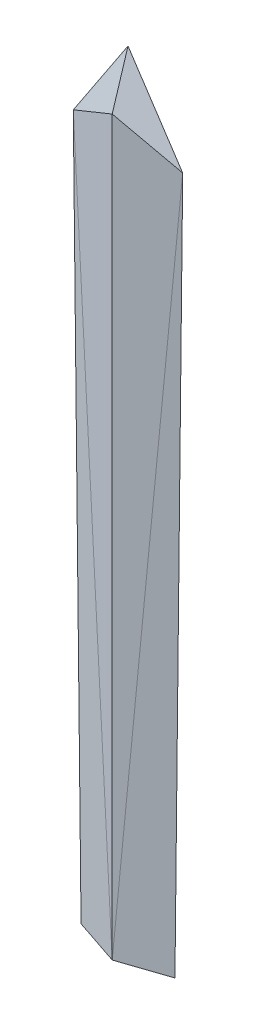
ISO-10303-21;
HEADER;
FILE_DESCRIPTION(('STEP AP214'),'2;1');
FILE_NAME('part.step','',(''),(''),'','','');
FILE_SCHEMA(('AUTOMOTIVE_DESIGN { 1 0 10303 214 1 1 1 1 }'));
ENDSEC;
DATA;
#1=APPLICATION_CONTEXT('core data for automotive mechanical design processes');
#2=APPLICATION_PROTOCOL_DEFINITION('international standard','automotive_design',2000,#1);
#3=PRODUCT_CONTEXT('',#1,'mechanical');
#4=PRODUCT('Part','Part','',(#3));
#5=PRODUCT_RELATED_PRODUCT_CATEGORY('part','',(#4));
#6=PRODUCT_DEFINITION_FORMATION('','',#4);
#7=PRODUCT_DEFINITION_CONTEXT('part definition',#1,'design');
#8=PRODUCT_DEFINITION('design','',#6,#7);
#9=PRODUCT_DEFINITION_SHAPE('','',#8);
#10=(LENGTH_UNIT() NAMED_UNIT(*) SI_UNIT(.MILLI.,.METRE.));
#11=(NAMED_UNIT(*) PLANE_ANGLE_UNIT() SI_UNIT($,.RADIAN.));
#12=(NAMED_UNIT(*) SI_UNIT($,.STERADIAN.) SOLID_ANGLE_UNIT());
#13=UNCERTAINTY_MEASURE_WITH_UNIT(LENGTH_MEASURE(1.E-05),#10,'distance_accuracy_value','');
#14=(GEOMETRIC_REPRESENTATION_CONTEXT(3) GLOBAL_UNCERTAINTY_ASSIGNED_CONTEXT((#13)) GLOBAL_UNIT_ASSIGNED_CONTEXT((#10,
#11,#12)) REPRESENTATION_CONTEXT('',''));
#15=CARTESIAN_POINT('',(0.,0.,0.));
#16=DIRECTION('',(0.,0.,1.));
#17=DIRECTION('',(1.,0.,0.));
#18=AXIS2_PLACEMENT_3D('',#15,#16,#17);
#19=CARTESIAN_POINT('',(110.489450024515,73.1619331243403,-236.171839963657));
#20=DIRECTION('',(0.407997117633771,0.270160253568307,-0.872096204208253));
#21=DIRECTION('',(-0.905777193696719,0.,-0.423754262962506));
#22=AXIS2_PLACEMENT_3D('',#19,#20,#21);
#23=PLANE('',#22);
#24=DIRECTION('',(-0.552097343274193,0.833779661271237,0.));
#25=VECTOR('',#24,1.);
#26=CARTESIAN_POINT('',(461.433600798645,305.5438707991,-1.78849990373209E-12));
#27=LINE('',#26,#25);
#28=CARTESIAN_POINT('',(134.118009413475,799.857212890993,3.85074061353269E-13));
#29=VERTEX_POINT('',#28);
#30=CARTESIAN_POINT('',(90.152766869332,866.253701631129,4.44089209850063E-13));
#31=VERTEX_POINT('',#30);
#32=EDGE_CURVE('E130',#29,#31,#27,.T.);
#33=ORIENTED_EDGE('',*,*,#32,.F.);
#34=DIRECTION('',(-0.84000590311682,0.48529585428181,-0.242647927140916));
#35=VECTOR('',#34,1.);
#36=CARTESIAN_POINT('',(365.545910408171,666.154579967653,66.8513164616736));
#37=LINE('',#36,#35);
#38=CARTESIAN_POINT('',(90.152766869332,825.257212890993,-12.7000000000001));
#39=VERTEX_POINT('',#38);
#40=EDGE_CURVE('E80',#29,#39,#37,.T.);
#41=ORIENTED_EDGE('',*,*,#40,.T.);
#42=DIRECTION('',(0.,0.955216031673375,0.295909332117407));
#43=VECTOR('',#42,1.);
#44=CARTESIAN_POINT('',(90.1527668693336,75.8511949410566,-244.852965301318));
#45=LINE('',#44,#43);
#46=EDGE_CURVE('E107',#39,#31,#45,.T.);
#47=ORIENTED_EDGE('',*,*,#46,.T.);
#48=EDGE_LOOP('',(#33,#41,#47));
#49=FACE_BOUND('',#48,.T.);
#50=ADVANCED_FACE('F33',(#49),#23,.T.);
#51=CARTESIAN_POINT('',(12.7456787896264,-0.140911784006167,-37.8714084386937));
#52=DIRECTION('',(0.318969504175096,-0.00352641570674579,-0.947758418479391));
#53=DIRECTION('',(-0.947764311510315,0.,-0.31897148748341));
#54=AXIS2_PLACEMENT_3D('',#51,#52,#53);
#55=PLANE('',#54);
#56=DIRECTION('',(0.947764311510315,0.,0.31897148748341));
#57=VECTOR('',#56,1.);
#58=CARTESIAN_POINT('',(9.17239581499852,236.384308447687,-39.954064220879));
#59=LINE('',#58,#57);
#60=CARTESIAN_POINT('',(90.1527668693318,236.384308447687,-12.7000000000001));
#61=VERTEX_POINT('',#60);
#62=CARTESIAN_POINT('',(127.888449300217,236.384308447687,0.));
#63=VERTEX_POINT('',#62);
#64=EDGE_CURVE('E84',#61,#63,#59,.T.);
#65=ORIENTED_EDGE('',*,*,#64,.F.);
#66=DIRECTION('',(0.0777694167912177,0.996718239691526,0.0224648275795778));
#67=VECTOR('',#66,1.);
#68=CARTESIAN_POINT('',(71.3065637328452,-5.1547848117741,-18.1439999868777));
#69=LINE('',#68,#67);
#70=EDGE_CURVE('E11',#61,#29,#69,.T.);
#71=ORIENTED_EDGE('',*,*,#70,.T.);
#72=DIRECTION('',(-0.0110549760023352,-0.999938891885693,0.));
#73=VECTOR('',#72,1.);
#74=CARTESIAN_POINT('',(125.259756565725,-1.38482822713404,0.));
#75=LINE('',#74,#73);
#76=EDGE_CURVE('E87',#29,#63,#75,.T.);
#77=ORIENTED_EDGE('',*,*,#76,.T.);
#78=EDGE_LOOP('',(#65,#71,#77));
#79=FACE_BOUND('',#78,.T.);
#80=ADVANCED_FACE('F85',(#79),#55,.T.);
#81=CARTESIAN_POINT('',(0.,236.384308447687,-12.7));
#82=DIRECTION('',(0.,-1.,0.));
#83=DIRECTION('',(0.,0.,-1.));
#84=AXIS2_PLACEMENT_3D('',#81,#82,#83);
#85=PLANE('',#84);
#86=CARTESIAN_POINT('',(90.1527668693318,236.384308447687,0.));
#87=DIRECTION('',(0.,-1.,0.));
#88=DIRECTION('',(0.,0.,-1.));
#89=AXIS2_PLACEMENT_3D('',#86,#87,#88);
#90=CIRCLE('',#89,4.7625);
#91=CARTESIAN_POINT('',(90.1527668693318,236.384308447687,-4.76250000000001));
#92=VERTEX_POINT('',#91);
#93=EDGE_CURVE('E197',#92,#92,#90,.T.);
#94=ORIENTED_EDGE('',*,*,#93,.F.);
#95=EDGE_LOOP('',(#94));
#96=FACE_BOUND('',#95,.T.);
#97=DIRECTION('',(0.947764311510315,0.,-0.31897148748341));
#98=VECTOR('',#97,1.);
#99=CARTESIAN_POINT('',(9.17239581499851,236.384308447687,14.554064220879));
#100=LINE('',#99,#98);
#101=CARTESIAN_POINT('',(52.417084438447,236.384308447687,0.));
#102=VERTEX_POINT('',#101);
#103=EDGE_CURVE('E100',#102,#61,#100,.T.);
#104=ORIENTED_EDGE('',*,*,#103,.T.);
#105=ORIENTED_EDGE('',*,*,#64,.T.);
#106=DIRECTION('',(0.947764311510314,0.,-0.318971487483411));
#107=VECTOR('',#106,1.);
#108=CARTESIAN_POINT('',(16.8510645375424,236.384308447687,37.3697968512636));
#109=LINE('',#108,#107);
#110=CARTESIAN_POINT('',(90.1527668693319,236.384308447687,12.7));
#111=VERTEX_POINT('',#110);
#112=EDGE_CURVE('E127',#111,#63,#109,.T.);
#113=ORIENTED_EDGE('',*,*,#112,.F.);
#114=DIRECTION('',(-0.947764311510314,0.,-0.318971487483411));
#115=VECTOR('',#114,1.);
#116=CARTESIAN_POINT('',(163.454469201122,236.384308447687,37.3697968512636));
#117=LINE('',#116,#115);
#118=EDGE_CURVE('E109',#111,#102,#117,.T.);
#119=ORIENTED_EDGE('',*,*,#118,.T.);
#120=EDGE_LOOP('',(#104,#105,#113,#119));
#121=FACE_BOUND('',#120,.T.);
#122=ADVANCED_FACE('F35',(#96,#121),#85,.T.);
#123=CARTESIAN_POINT('',(-80.4754937353133,53.2878269328421,-172.016834396731));
#124=DIRECTION('',(-0.407997117633771,0.270160253568305,-0.872096204208254));
#125=DIRECTION('',(-0.905777193696719,0.,0.423754262962506));
#126=AXIS2_PLACEMENT_3D('',#123,#124,#125);
#127=PLANE('',#126);
#128=ORIENTED_EDGE('',*,*,#46,.F.);
#129=DIRECTION('',(-0.840005903116817,-0.485295854281818,0.242647927140913));
#130=VECTOR('',#129,1.);
#131=CARTESIAN_POINT('',(-312.465749414372,592.652779892853,103.602216499072));
#132=LINE('',#131,#130);
#133=CARTESIAN_POINT('',(46.1875243251886,799.85721289099,2.77555756156289E-13));
#134=VERTEX_POINT('',#133);
#135=EDGE_CURVE('E92',#39,#134,#132,.T.);
#136=ORIENTED_EDGE('',*,*,#135,.T.);
#137=DIRECTION('',(0.552097343274193,0.833779661271237,0.));
#138=VECTOR('',#137,1.);
#139=CARTESIAN_POINT('',(-281.128067059981,305.5438707991,-1.78849990373209E-12));
#140=LINE('',#139,#138);
#141=EDGE_CURVE('E111',#134,#31,#140,.T.);
#142=ORIENTED_EDGE('',*,*,#141,.T.);
#143=EDGE_LOOP('',(#128,#136,#142));
#144=FACE_BOUND('',#143,.T.);
#145=ADVANCED_FACE('F168',(#144),#127,.T.);
#146=CARTESIAN_POINT('',(5.59888471173792,0.0618993186787379,16.6360421613606));
#147=DIRECTION('',(-0.318969504175096,-0.00352641570674611,-0.947758418479391));
#148=DIRECTION('',(-0.947764311510315,0.,0.31897148748341));
#149=AXIS2_PLACEMENT_3D('',#146,#147,#148);
#150=PLANE('',#149);
#151=DIRECTION('',(0.0110549760023352,-0.999938891885693,0.));
#152=VECTOR('',#151,1.);
#153=CARTESIAN_POINT('',(55.0457771729392,-1.38482822713404,0.));
#154=LINE('',#153,#152);
#155=EDGE_CURVE('E106',#134,#102,#154,.T.);
#156=ORIENTED_EDGE('',*,*,#155,.F.);
#157=DIRECTION('',(0.077769416791218,-0.996718239691526,-0.0224648275795776));
#158=VECTOR('',#157,1.);
#159=CARTESIAN_POINT('',(107.908467318808,8.82145370746849,-17.8289924189985));
#160=LINE('',#159,#158);
#161=EDGE_CURVE('E41',#134,#61,#160,.T.);
#162=ORIENTED_EDGE('',*,*,#161,.T.);
#163=ORIENTED_EDGE('',*,*,#103,.F.);
#164=EDGE_LOOP('',(#156,#162,#163));
#165=FACE_BOUND('',#164,.T.);
#166=ADVANCED_FACE('F104',(#165),#150,.T.);
#167=CARTESIAN_POINT('',(110.489450024508,73.1619331243352,236.171839963652));
#168=DIRECTION('',(0.407997117633762,0.270160253568297,0.87209620420826));
#169=DIRECTION('',(0.905777193696724,0.,-0.423754262962496));
#170=AXIS2_PLACEMENT_3D('',#167,#168,#169);
#171=PLANE('',#170);
#172=DIRECTION('',(-0.840005903116813,0.48529585428183,0.242647927140902));
#173=VECTOR('',#172,1.);
#174=CARTESIAN_POINT('',(365.545910408184,666.154579967639,-66.8513164616731));
#175=LINE('',#174,#173);
#176=CARTESIAN_POINT('',(90.152766869332,825.257212890994,12.7));
#177=VERTEX_POINT('',#176);
#178=EDGE_CURVE('E120',#29,#177,#175,.T.);
#179=ORIENTED_EDGE('',*,*,#178,.F.);
#180=ORIENTED_EDGE('',*,*,#32,.T.);
#181=DIRECTION('',(0.,-0.955216031673378,0.295909332117398));
#182=VECTOR('',#181,1.);
#183=CARTESIAN_POINT('',(90.1527668693274,75.8511949410515,244.852965301312));
#184=LINE('',#183,#182);
#185=EDGE_CURVE('E133',#31,#177,#184,.T.);
#186=ORIENTED_EDGE('',*,*,#185,.T.);
#187=EDGE_LOOP('',(#179,#180,#186));
#188=FACE_BOUND('',#187,.T.);
#189=ADVANCED_FACE('F146',(#188),#171,.T.);
#190=CARTESIAN_POINT('',(12.7456787896264,-0.140911784006211,37.8714084386934));
#191=DIRECTION('',(-0.318969504175096,0.00352641570674691,-0.947758418479391));
#192=DIRECTION('',(-0.947764311510314,0.,0.318971487483411));
#193=AXIS2_PLACEMENT_3D('',#190,#191,#192);
#194=PLANE('',#193);
#195=DIRECTION('',(-0.077769416791218,-0.996718239691526,0.0224648275795768));
#196=VECTOR('',#195,1.);
#197=CARTESIAN_POINT('',(90.152766869332,236.384308447687,12.7));
#198=LINE('',#197,#196);
#199=EDGE_CURVE('E124',#29,#111,#198,.T.);
#200=ORIENTED_EDGE('',*,*,#199,.T.);
#201=ORIENTED_EDGE('',*,*,#112,.T.);
#202=ORIENTED_EDGE('',*,*,#76,.F.);
#203=EDGE_LOOP('',(#200,#201,#202));
#204=FACE_BOUND('',#203,.T.);
#205=ADVANCED_FACE('F149',(#204),#194,.F.);
#206=CARTESIAN_POINT('',(10.3292701271396,0.,35.7581784601317));
#207=DIRECTION('',(-0.277518070961192,0.,-0.960720417337936));
#208=DIRECTION('',(-0.960720417337936,0.,0.277518070961192));
#209=AXIS2_PLACEMENT_3D('',#206,#207,#208);
#210=PLANE('',#209);
#211=DIRECTION('',(0.,-1.,0.));
#212=VECTOR('',#211,1.);
#213=CARTESIAN_POINT('',(90.1527668693321,0.,12.7));
#214=LINE('',#213,#212);
#215=EDGE_CURVE('E48',#177,#111,#214,.T.);
#216=ORIENTED_EDGE('',*,*,#215,.T.);
#217=ORIENTED_EDGE('',*,*,#199,.F.);
#218=ORIENTED_EDGE('',*,*,#178,.T.);
#219=EDGE_LOOP('',(#216,#217,#218));
#220=FACE_BOUND('',#219,.T.);
#221=ADVANCED_FACE('F150',(#220),#210,.F.);
#222=CARTESIAN_POINT('',(69.8160837141555,73.1619331243352,236.171839963652));
#223=DIRECTION('',(-0.407997117633762,0.270160253568297,0.87209620420826));
#224=DIRECTION('',(-0.905777193696724,0.,-0.423754262962496));
#225=AXIS2_PLACEMENT_3D('',#222,#223,#224);
#226=PLANE('',#225);
#227=DIRECTION('',(0.840005903116813,0.48529585428183,0.242647927140902));
#228=VECTOR('',#227,1.);
#229=CARTESIAN_POINT('',(-185.24037666952,666.154579967639,-66.8513164616731));
#230=LINE('',#229,#228);
#231=EDGE_CURVE('E117',#134,#177,#230,.T.);
#232=ORIENTED_EDGE('',*,*,#231,.T.);
#233=ORIENTED_EDGE('',*,*,#185,.F.);
#234=ORIENTED_EDGE('',*,*,#141,.F.);
#235=EDGE_LOOP('',(#232,#233,#234));
#236=FACE_BOUND('',#235,.T.);
#237=ADVANCED_FACE('F143',(#236),#226,.T.);
#238=CARTESIAN_POINT('',(167.559854949038,-0.140911784006211,37.8714084386934));
#239=DIRECTION('',(0.318969504175096,0.00352641570674691,-0.947758418479391));
#240=DIRECTION('',(0.947764311510314,0.,0.318971487483411));
#241=AXIS2_PLACEMENT_3D('',#238,#239,#240);
#242=PLANE('',#241);
#243=DIRECTION('',(0.077769416791218,-0.996718239691526,0.0224648275795768));
#244=VECTOR('',#243,1.);
#245=CARTESIAN_POINT('',(90.152766869332,236.384308447687,12.7));
#246=LINE('',#245,#244);
#247=EDGE_CURVE('E52',#134,#111,#246,.T.);
#248=ORIENTED_EDGE('',*,*,#247,.F.);
#249=ORIENTED_EDGE('',*,*,#155,.T.);
#250=ORIENTED_EDGE('',*,*,#118,.F.);
#251=EDGE_LOOP('',(#248,#249,#250));
#252=FACE_BOUND('',#251,.T.);
#253=ADVANCED_FACE('F157',(#252),#242,.F.);
#254=CARTESIAN_POINT('',(169.976263611524,0.,35.7581784601317));
#255=DIRECTION('',(0.277518070961192,0.,-0.960720417337936));
#256=DIRECTION('',(0.960720417337936,0.,0.277518070961192));
#257=AXIS2_PLACEMENT_3D('',#254,#255,#256);
#258=PLANE('',#257);
#259=ORIENTED_EDGE('',*,*,#215,.F.);
#260=ORIENTED_EDGE('',*,*,#231,.F.);
#261=ORIENTED_EDGE('',*,*,#247,.T.);
#262=EDGE_LOOP('',(#259,#260,#261));
#263=FACE_BOUND('',#262,.T.);
#264=ADVANCED_FACE('F172',(#263),#258,.F.);
#265=CARTESIAN_POINT('',(3.55719129254251,0.,12.3143919647671));
#266=DIRECTION('',(-0.277518070961203,0.,-0.960720417337933));
#267=DIRECTION('',(-0.960720417337933,0.,0.277518070961203));
#268=AXIS2_PLACEMENT_3D('',#265,#266,#267);
#269=PLANE('',#268);
#270=DIRECTION('',(0.,-1.,0.));
#271=VECTOR('',#270,1.);
#272=CARTESIAN_POINT('',(90.1527668693321,0.,-12.7));
#273=LINE('',#272,#271);
#274=EDGE_CURVE('E78',#39,#61,#273,.T.);
#275=ORIENTED_EDGE('',*,*,#274,.T.);
#276=ORIENTED_EDGE('',*,*,#161,.F.);
#277=ORIENTED_EDGE('',*,*,#135,.F.);
#278=EDGE_LOOP('',(#275,#276,#277));
#279=FACE_BOUND('',#278,.T.);
#280=ADVANCED_FACE('F97',(#279),#269,.T.);
#281=CARTESIAN_POINT('',(10.3292701271404,0.,-35.7581784601326));
#282=DIRECTION('',(0.277518070961206,0.,-0.960720417337933));
#283=DIRECTION('',(-0.960720417337933,0.,-0.277518070961206));
#284=AXIS2_PLACEMENT_3D('',#281,#282,#283);
#285=PLANE('',#284);
#286=ORIENTED_EDGE('',*,*,#70,.F.);
#287=ORIENTED_EDGE('',*,*,#274,.F.);
#288=ORIENTED_EDGE('',*,*,#40,.F.);
#289=EDGE_LOOP('',(#286,#287,#288));
#290=FACE_BOUND('',#289,.T.);
#291=ADVANCED_FACE('F76',(#290),#285,.T.);
#292=CARTESIAN_POINT('',(90.1527668693318,744.384308447687,0.));
#293=DIRECTION('',(0.,-1.,0.));
#294=DIRECTION('',(0.,0.,-1.));
#295=AXIS2_PLACEMENT_3D('',#292,#293,#294);
#296=CYLINDRICAL_SURFACE('',#295,4.7625);
#297=CARTESIAN_POINT('',(90.1527668693318,744.384308447687,0.));
#298=DIRECTION('',(0.,-1.,0.));
#299=DIRECTION('',(0.,0.,-1.));
#300=AXIS2_PLACEMENT_3D('',#297,#298,#299);
#301=CIRCLE('',#300,4.7625);
#302=CARTESIAN_POINT('',(90.1527668693318,744.384308447687,-4.76250000000001));
#303=VERTEX_POINT('',#302);
#304=EDGE_CURVE('E199',#303,#303,#301,.T.);
#305=ORIENTED_EDGE('',*,*,#304,.F.);
#306=EDGE_LOOP('',(#305));
#307=FACE_BOUND('',#306,.T.);
#308=ORIENTED_EDGE('',*,*,#93,.T.);
#309=EDGE_LOOP('',(#308));
#310=FACE_BOUND('',#309,.T.);
#311=ADVANCED_FACE('F182',(#307,#310),#296,.F.);
#312=CARTESIAN_POINT('',(90.1527668693318,744.384308447687,0.));
#313=DIRECTION('',(0.,-1.,0.));
#314=DIRECTION('',(0.,0.,-1.));
#315=AXIS2_PLACEMENT_3D('',#312,#313,#314);
#316=PLANE('',#315);
#317=ORIENTED_EDGE('',*,*,#304,.T.);
#318=EDGE_LOOP('',(#317));
#319=FACE_BOUND('',#318,.T.);
#320=ADVANCED_FACE('F206',(#319),#316,.T.);
#321=CLOSED_SHELL('',(#50,#80,#122,#145,#166,#189,#205,#221,#237,#253,#264,#280,#291,#311,#320));
#322=MANIFOLD_SOLID_BREP('B2',#321);
#323=ADVANCED_BREP_SHAPE_REPRESENTATION('',(#18,#322),#14);
#324=SHAPE_DEFINITION_REPRESENTATION(#9,#323);
ENDSEC;
END-ISO-10303-21;
